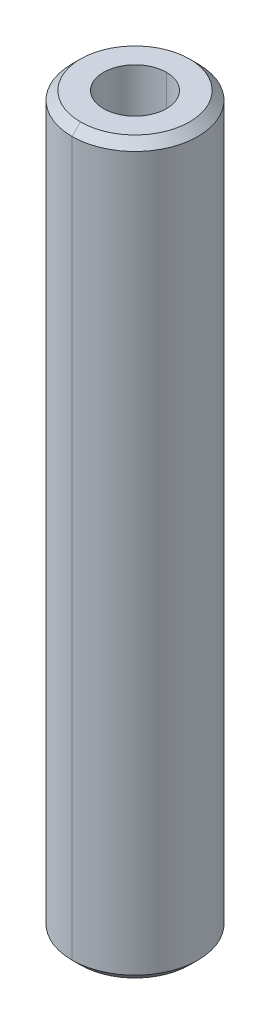
ISO-10303-21;
HEADER;
FILE_DESCRIPTION(('STEP AP214'),'2;1');
FILE_NAME('part.step','',(''),(''),'','','');
FILE_SCHEMA(('AUTOMOTIVE_DESIGN { 1 0 10303 214 1 1 1 1 }'));
ENDSEC;
DATA;
#1=APPLICATION_CONTEXT('core data for automotive mechanical design processes');
#2=APPLICATION_PROTOCOL_DEFINITION('international standard','automotive_design',2000,#1);
#3=PRODUCT_CONTEXT('',#1,'mechanical');
#4=PRODUCT('Part','Part','',(#3));
#5=PRODUCT_RELATED_PRODUCT_CATEGORY('part','',(#4));
#6=PRODUCT_DEFINITION_FORMATION('','',#4);
#7=PRODUCT_DEFINITION_CONTEXT('part definition',#1,'design');
#8=PRODUCT_DEFINITION('design','',#6,#7);
#9=PRODUCT_DEFINITION_SHAPE('','',#8);
#10=(LENGTH_UNIT() NAMED_UNIT(*) SI_UNIT(.MILLI.,.METRE.));
#11=(NAMED_UNIT(*) PLANE_ANGLE_UNIT() SI_UNIT($,.RADIAN.));
#12=(NAMED_UNIT(*) SI_UNIT($,.STERADIAN.) SOLID_ANGLE_UNIT());
#13=UNCERTAINTY_MEASURE_WITH_UNIT(LENGTH_MEASURE(1.E-05),#10,'distance_accuracy_value','');
#14=(GEOMETRIC_REPRESENTATION_CONTEXT(3) GLOBAL_UNCERTAINTY_ASSIGNED_CONTEXT((#13)) GLOBAL_UNIT_ASSIGNED_CONTEXT((#10,
#11,#12)) REPRESENTATION_CONTEXT('',''));
#15=CARTESIAN_POINT('',(0.,0.,0.));
#16=DIRECTION('',(0.,0.,1.));
#17=DIRECTION('',(1.,0.,0.));
#18=AXIS2_PLACEMENT_3D('',#15,#16,#17);
#19=CARTESIAN_POINT('',(0.,0.,0.));
#20=DIRECTION('',(0.,1.,0.));
#21=DIRECTION('',(0.,0.,1.));
#22=AXIS2_PLACEMENT_3D('',#19,#20,#21);
#23=CYLINDRICAL_SURFACE('',#22,1.5);
#24=DIRECTION('',(0.,1.,0.));
#25=VECTOR('',#24,1.);
#26=CARTESIAN_POINT('',(0.,0.,-1.5));
#27=LINE('',#26,#25);
#28=CARTESIAN_POINT('',(0.,0.,-1.5));
#29=VERTEX_POINT('',#28);
#30=CARTESIAN_POINT('',(0.,34.8,-1.5));
#31=VERTEX_POINT('',#30);
#32=EDGE_CURVE('E98',#29,#31,#27,.T.);
#33=ORIENTED_EDGE('',*,*,#32,.F.);
#34=CARTESIAN_POINT('',(0.,0.,0.));
#35=DIRECTION('',(0.,1.,0.));
#36=DIRECTION('',(0.,0.,1.));
#37=AXIS2_PLACEMENT_3D('',#34,#35,#36);
#38=CIRCLE('',#37,1.5);
#39=CARTESIAN_POINT('',(0.,0.,1.5));
#40=VERTEX_POINT('',#39);
#41=EDGE_CURVE('E11',#40,#29,#38,.T.);
#42=ORIENTED_EDGE('',*,*,#41,.F.);
#43=DIRECTION('',(0.,1.,0.));
#44=VECTOR('',#43,1.);
#45=CARTESIAN_POINT('',(0.,0.,1.5));
#46=LINE('',#45,#44);
#47=CARTESIAN_POINT('',(0.,34.8,1.5));
#48=VERTEX_POINT('',#47);
#49=EDGE_CURVE('E107',#40,#48,#46,.T.);
#50=ORIENTED_EDGE('',*,*,#49,.T.);
#51=CARTESIAN_POINT('',(0.,34.8,0.));
#52=DIRECTION('',(0.,1.,0.));
#53=DIRECTION('',(0.,0.,1.));
#54=AXIS2_PLACEMENT_3D('',#51,#52,#53);
#55=CIRCLE('',#54,1.5);
#56=EDGE_CURVE('E99',#48,#31,#55,.T.);
#57=ORIENTED_EDGE('',*,*,#56,.T.);
#58=EDGE_LOOP('',(#33,#42,#50,#57));
#59=FACE_BOUND('',#58,.T.);
#60=ADVANCED_FACE('F17',(#59),#23,.F.);
#61=CARTESIAN_POINT('',(0.,34.8,0.));
#62=DIRECTION('',(0.,-1.,0.));
#63=DIRECTION('',(0.,0.,-1.));
#64=AXIS2_PLACEMENT_3D('',#61,#62,#63);
#65=CONICAL_SURFACE('',#64,2.6,0.78539816339745);
#66=DIRECTION('',(0.,-0.707106781186546,0.707106781186549));
#67=VECTOR('',#66,1.);
#68=CARTESIAN_POINT('',(0.,34.8,2.6));
#69=LINE('',#68,#67);
#70=CARTESIAN_POINT('',(0.,34.8,2.6));
#71=VERTEX_POINT('',#70);
#72=CARTESIAN_POINT('',(0.,34.4,3.));
#73=VERTEX_POINT('',#72);
#74=EDGE_CURVE('E138',#71,#73,#69,.T.);
#75=ORIENTED_EDGE('',*,*,#74,.F.);
#76=CARTESIAN_POINT('',(0.,34.8,0.));
#77=DIRECTION('',(0.,1.,0.));
#78=DIRECTION('',(0.,0.,1.));
#79=AXIS2_PLACEMENT_3D('',#76,#77,#78);
#80=CIRCLE('',#79,2.6);
#81=CARTESIAN_POINT('',(0.,34.8,-2.6));
#82=VERTEX_POINT('',#81);
#83=EDGE_CURVE('E126',#82,#71,#80,.T.);
#84=ORIENTED_EDGE('',*,*,#83,.F.);
#85=DIRECTION('',(0.,-0.707106781186546,-0.707106781186549));
#86=VECTOR('',#85,1.);
#87=CARTESIAN_POINT('',(0.,34.8,-2.6));
#88=LINE('',#87,#86);
#89=CARTESIAN_POINT('',(0.,34.4,-3.));
#90=VERTEX_POINT('',#89);
#91=EDGE_CURVE('E117',#82,#90,#88,.T.);
#92=ORIENTED_EDGE('',*,*,#91,.T.);
#93=CARTESIAN_POINT('',(0.,34.4,0.));
#94=DIRECTION('',(0.,-1.,0.));
#95=DIRECTION('',(0.,0.,1.));
#96=AXIS2_PLACEMENT_3D('',#93,#94,#95);
#97=CIRCLE('',#96,3.);
#98=EDGE_CURVE('E127',#73,#90,#97,.T.);
#99=ORIENTED_EDGE('',*,*,#98,.F.);
#100=EDGE_LOOP('',(#75,#84,#92,#99));
#101=FACE_BOUND('',#100,.T.);
#102=ADVANCED_FACE('F238',(#101),#65,.T.);
#103=CARTESIAN_POINT('',(0.,0.4,0.));
#104=DIRECTION('',(0.,1.,0.));
#105=DIRECTION('',(0.,0.,1.));
#106=AXIS2_PLACEMENT_3D('',#103,#104,#105);
#107=CONICAL_SURFACE('',#106,3.,0.785398163397445);
#108=DIRECTION('',(0.,0.70710678118655,-0.707106781186545));
#109=VECTOR('',#108,1.);
#110=CARTESIAN_POINT('',(0.,0.4,-3.));
#111=LINE('',#110,#109);
#112=CARTESIAN_POINT('',(0.,0.,-2.6));
#113=VERTEX_POINT('',#112);
#114=CARTESIAN_POINT('',(0.,0.4,-3.));
#115=VERTEX_POINT('',#114);
#116=EDGE_CURVE('E150',#113,#115,#111,.T.);
#117=ORIENTED_EDGE('',*,*,#116,.F.);
#118=CARTESIAN_POINT('',(0.,0.,0.));
#119=DIRECTION('',(0.,-1.,0.));
#120=DIRECTION('',(0.,0.,1.));
#121=AXIS2_PLACEMENT_3D('',#118,#119,#120);
#122=CIRCLE('',#121,2.6);
#123=CARTESIAN_POINT('',(0.,0.,2.6));
#124=VERTEX_POINT('',#123);
#125=EDGE_CURVE('E26',#124,#113,#122,.T.);
#126=ORIENTED_EDGE('',*,*,#125,.F.);
#127=DIRECTION('',(0.,0.70710678118655,0.707106781186545));
#128=VECTOR('',#127,1.);
#129=CARTESIAN_POINT('',(0.,0.4,3.));
#130=LINE('',#129,#128);
#131=CARTESIAN_POINT('',(0.,0.4,3.));
#132=VERTEX_POINT('',#131);
#133=EDGE_CURVE('E116',#124,#132,#130,.T.);
#134=ORIENTED_EDGE('',*,*,#133,.T.);
#135=CARTESIAN_POINT('',(0.,0.4,0.));
#136=DIRECTION('',(0.,1.,0.));
#137=DIRECTION('',(0.,0.,1.));
#138=AXIS2_PLACEMENT_3D('',#135,#136,#137);
#139=CIRCLE('',#138,3.);
#140=EDGE_CURVE('E39',#115,#132,#139,.T.);
#141=ORIENTED_EDGE('',*,*,#140,.F.);
#142=EDGE_LOOP('',(#117,#126,#134,#141));
#143=FACE_BOUND('',#142,.T.);
#144=ADVANCED_FACE('F168',(#143),#107,.T.);
#145=CARTESIAN_POINT('',(0.,0.,0.));
#146=DIRECTION('',(0.,1.,0.));
#147=DIRECTION('',(1.,0.,0.));
#148=AXIS2_PLACEMENT_3D('',#145,#146,#147);
#149=PLANE('',#148);
#150=ORIENTED_EDGE('',*,*,#41,.T.);
#151=CARTESIAN_POINT('',(0.,0.,0.));
#152=DIRECTION('',(0.,1.,0.));
#153=DIRECTION('',(0.,0.,1.));
#154=AXIS2_PLACEMENT_3D('',#151,#152,#153);
#155=CIRCLE('',#154,1.5);
#156=EDGE_CURVE('E93',#29,#40,#155,.T.);
#157=ORIENTED_EDGE('',*,*,#156,.T.);
#158=EDGE_LOOP('',(#150,#157));
#159=FACE_BOUND('',#158,.T.);
#160=ORIENTED_EDGE('',*,*,#125,.T.);
#161=CARTESIAN_POINT('',(0.,0.,0.));
#162=DIRECTION('',(0.,-1.,0.));
#163=DIRECTION('',(0.,0.,1.));
#164=AXIS2_PLACEMENT_3D('',#161,#162,#163);
#165=CIRCLE('',#164,2.6);
#166=EDGE_CURVE('E119',#113,#124,#165,.T.);
#167=ORIENTED_EDGE('',*,*,#166,.T.);
#168=EDGE_LOOP('',(#160,#167));
#169=FACE_BOUND('',#168,.T.);
#170=ADVANCED_FACE('F19',(#159,#169),#149,.F.);
#171=CARTESIAN_POINT('',(0.,34.8,0.));
#172=DIRECTION('',(0.,1.,0.));
#173=DIRECTION('',(1.,0.,0.));
#174=AXIS2_PLACEMENT_3D('',#171,#172,#173);
#175=PLANE('',#174);
#176=ORIENTED_EDGE('',*,*,#56,.F.);
#177=CARTESIAN_POINT('',(0.,34.8,0.));
#178=DIRECTION('',(0.,1.,0.));
#179=DIRECTION('',(0.,0.,1.));
#180=AXIS2_PLACEMENT_3D('',#177,#178,#179);
#181=CIRCLE('',#180,1.5);
#182=EDGE_CURVE('E104',#31,#48,#181,.T.);
#183=ORIENTED_EDGE('',*,*,#182,.F.);
#184=EDGE_LOOP('',(#176,#183));
#185=FACE_BOUND('',#184,.T.);
#186=ORIENTED_EDGE('',*,*,#83,.T.);
#187=CARTESIAN_POINT('',(0.,34.8,0.));
#188=DIRECTION('',(0.,1.,0.));
#189=DIRECTION('',(0.,0.,1.));
#190=AXIS2_PLACEMENT_3D('',#187,#188,#189);
#191=CIRCLE('',#190,2.6);
#192=EDGE_CURVE('E134',#71,#82,#191,.T.);
#193=ORIENTED_EDGE('',*,*,#192,.T.);
#194=EDGE_LOOP('',(#186,#193));
#195=FACE_BOUND('',#194,.T.);
#196=ADVANCED_FACE('F286',(#185,#195),#175,.T.);
#197=CARTESIAN_POINT('',(0.,34.8,0.));
#198=DIRECTION('',(0.,-1.,0.));
#199=DIRECTION('',(0.,0.,-1.));
#200=AXIS2_PLACEMENT_3D('',#197,#198,#199);
#201=CYLINDRICAL_SURFACE('',#200,3.);
#202=DIRECTION('',(0.,-1.,0.));
#203=VECTOR('',#202,1.);
#204=CARTESIAN_POINT('',(0.,34.8,3.));
#205=LINE('',#204,#203);
#206=EDGE_CURVE('E131',#73,#132,#205,.T.);
#207=ORIENTED_EDGE('',*,*,#206,.F.);
#208=ORIENTED_EDGE('',*,*,#98,.T.);
#209=DIRECTION('',(0.,-1.,0.));
#210=VECTOR('',#209,1.);
#211=CARTESIAN_POINT('',(0.,34.8,-3.));
#212=LINE('',#211,#210);
#213=EDGE_CURVE('E128',#90,#115,#212,.T.);
#214=ORIENTED_EDGE('',*,*,#213,.T.);
#215=ORIENTED_EDGE('',*,*,#140,.T.);
#216=EDGE_LOOP('',(#207,#208,#214,#215));
#217=FACE_BOUND('',#216,.T.);
#218=ADVANCED_FACE('F277',(#217),#201,.T.);
#219=CARTESIAN_POINT('',(0.,34.8,0.));
#220=DIRECTION('',(0.,-1.,0.));
#221=DIRECTION('',(0.,0.,-1.));
#222=AXIS2_PLACEMENT_3D('',#219,#220,#221);
#223=CYLINDRICAL_SURFACE('',#222,3.);
#224=CARTESIAN_POINT('',(0.,34.4,0.));
#225=DIRECTION('',(0.,-1.,0.));
#226=DIRECTION('',(0.,0.,1.));
#227=AXIS2_PLACEMENT_3D('',#224,#225,#226);
#228=CIRCLE('',#227,3.);
#229=EDGE_CURVE('E120',#90,#73,#228,.T.);
#230=ORIENTED_EDGE('',*,*,#229,.T.);
#231=ORIENTED_EDGE('',*,*,#206,.T.);
#232=CARTESIAN_POINT('',(0.,0.4,0.));
#233=DIRECTION('',(0.,1.,0.));
#234=DIRECTION('',(0.,0.,1.));
#235=AXIS2_PLACEMENT_3D('',#232,#233,#234);
#236=CIRCLE('',#235,3.);
#237=EDGE_CURVE('E154',#132,#115,#236,.T.);
#238=ORIENTED_EDGE('',*,*,#237,.T.);
#239=ORIENTED_EDGE('',*,*,#213,.F.);
#240=EDGE_LOOP('',(#230,#231,#238,#239));
#241=FACE_BOUND('',#240,.T.);
#242=ADVANCED_FACE('F269',(#241),#223,.T.);
#243=CARTESIAN_POINT('',(0.,0.4,0.));
#244=DIRECTION('',(0.,1.,0.));
#245=DIRECTION('',(0.,0.,1.));
#246=AXIS2_PLACEMENT_3D('',#243,#244,#245);
#247=CONICAL_SURFACE('',#246,3.,0.785398163397445);
#248=ORIENTED_EDGE('',*,*,#166,.F.);
#249=ORIENTED_EDGE('',*,*,#116,.T.);
#250=ORIENTED_EDGE('',*,*,#237,.F.);
#251=ORIENTED_EDGE('',*,*,#133,.F.);
#252=EDGE_LOOP('',(#248,#249,#250,#251));
#253=FACE_BOUND('',#252,.T.);
#254=ADVANCED_FACE('F171',(#253),#247,.T.);
#255=CARTESIAN_POINT('',(0.,34.8,0.));
#256=DIRECTION('',(0.,-1.,0.));
#257=DIRECTION('',(0.,0.,-1.));
#258=AXIS2_PLACEMENT_3D('',#255,#256,#257);
#259=CONICAL_SURFACE('',#258,2.6,0.78539816339745);
#260=ORIENTED_EDGE('',*,*,#192,.F.);
#261=ORIENTED_EDGE('',*,*,#74,.T.);
#262=ORIENTED_EDGE('',*,*,#229,.F.);
#263=ORIENTED_EDGE('',*,*,#91,.F.);
#264=EDGE_LOOP('',(#260,#261,#262,#263));
#265=FACE_BOUND('',#264,.T.);
#266=ADVANCED_FACE('F246',(#265),#259,.T.);
#267=CARTESIAN_POINT('',(0.,0.,0.));
#268=DIRECTION('',(0.,1.,0.));
#269=DIRECTION('',(0.,0.,1.));
#270=AXIS2_PLACEMENT_3D('',#267,#268,#269);
#271=CYLINDRICAL_SURFACE('',#270,1.5);
#272=ORIENTED_EDGE('',*,*,#156,.F.);
#273=ORIENTED_EDGE('',*,*,#32,.T.);
#274=ORIENTED_EDGE('',*,*,#182,.T.);
#275=ORIENTED_EDGE('',*,*,#49,.F.);
#276=EDGE_LOOP('',(#272,#273,#274,#275));
#277=FACE_BOUND('',#276,.T.);
#278=ADVANCED_FACE('F106',(#277),#271,.F.);
#279=CLOSED_SHELL('',(#60,#102,#144,#170,#196,#218,#242,#254,#266,#278));
#280=MANIFOLD_SOLID_BREP('B1',#279);
#281=ADVANCED_BREP_SHAPE_REPRESENTATION('',(#18,#280),#14);
#282=SHAPE_DEFINITION_REPRESENTATION(#9,#281);
ENDSEC;
END-ISO-10303-21;
